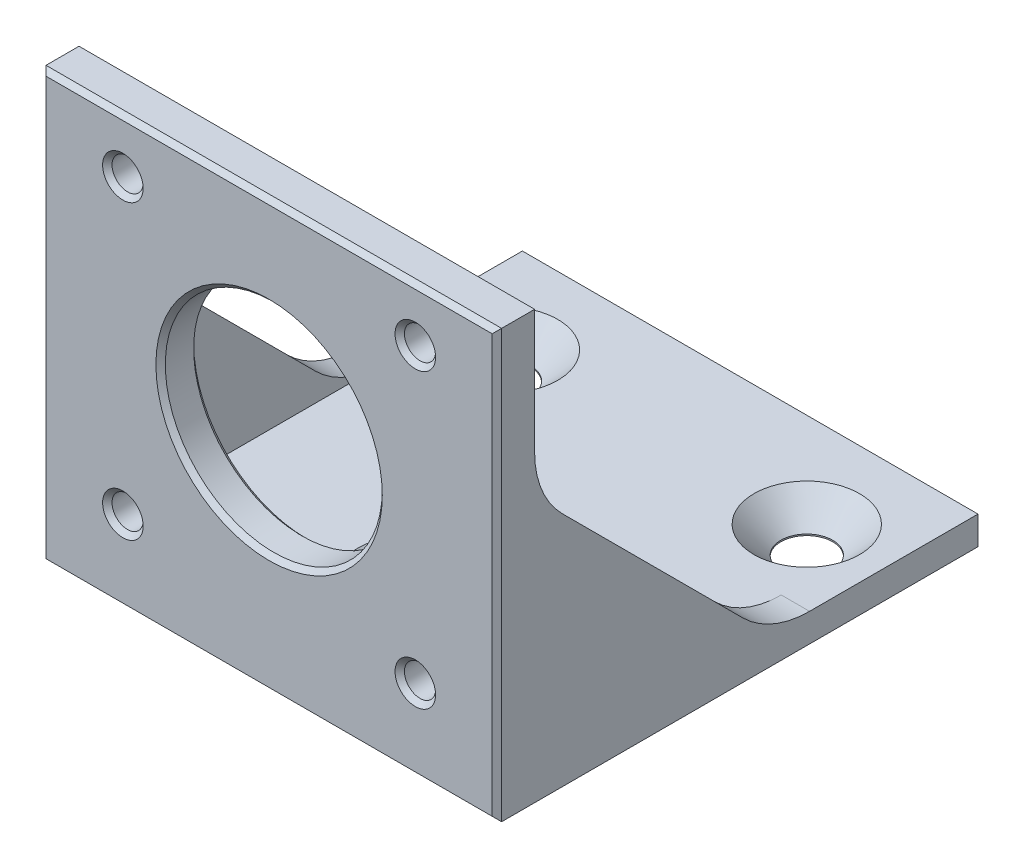
ISO-10303-21;
HEADER;
FILE_DESCRIPTION(('STEP AP214'),'2;1');
FILE_NAME('part.step','',(''),(''),'','','');
FILE_SCHEMA(('AUTOMOTIVE_DESIGN { 1 0 10303 214 1 1 1 1 }'));
ENDSEC;
DATA;
#1=APPLICATION_CONTEXT('core data for automotive mechanical design processes');
#2=APPLICATION_PROTOCOL_DEFINITION('international standard','automotive_design',2000,#1);
#3=PRODUCT_CONTEXT('',#1,'mechanical');
#4=PRODUCT('Part','Part','',(#3));
#5=PRODUCT_RELATED_PRODUCT_CATEGORY('part','',(#4));
#6=PRODUCT_DEFINITION_FORMATION('','',#4);
#7=PRODUCT_DEFINITION_CONTEXT('part definition',#1,'design');
#8=PRODUCT_DEFINITION('design','',#6,#7);
#9=PRODUCT_DEFINITION_SHAPE('','',#8);
#10=(LENGTH_UNIT() NAMED_UNIT(*) SI_UNIT(.MILLI.,.METRE.));
#11=(NAMED_UNIT(*) PLANE_ANGLE_UNIT() SI_UNIT($,.RADIAN.));
#12=(NAMED_UNIT(*) SI_UNIT($,.STERADIAN.) SOLID_ANGLE_UNIT());
#13=UNCERTAINTY_MEASURE_WITH_UNIT(LENGTH_MEASURE(1.E-05),#10,'distance_accuracy_value','');
#14=(GEOMETRIC_REPRESENTATION_CONTEXT(3) GLOBAL_UNCERTAINTY_ASSIGNED_CONTEXT((#13)) GLOBAL_UNIT_ASSIGNED_CONTEXT((#10,
#11,#12)) REPRESENTATION_CONTEXT('',''));
#15=CARTESIAN_POINT('',(0.,0.,0.));
#16=DIRECTION('',(0.,0.,1.));
#17=DIRECTION('',(1.,0.,0.));
#18=AXIS2_PLACEMENT_3D('',#15,#16,#17);
#19=CARTESIAN_POINT('',(0.,-24.15,0.));
#20=DIRECTION('',(0.,-1.,0.));
#21=DIRECTION('',(1.,0.,0.));
#22=AXIS2_PLACEMENT_3D('',#19,#20,#21);
#23=PLANE('',#22);
#24=CARTESIAN_POINT('',(0.,-24.15,-11.));
#25=DIRECTION('',(0.,1.,0.));
#26=DIRECTION('',(0.,0.,1.));
#27=AXIS2_PLACEMENT_3D('',#24,#25,#26);
#28=CIRCLE('',#27,2.75);
#29=CARTESIAN_POINT('',(0.,-24.15,-8.25));
#30=VERTEX_POINT('',#29);
#31=EDGE_CURVE('E505',#30,#30,#28,.T.);
#32=ORIENTED_EDGE('',*,*,#31,.T.);
#33=EDGE_LOOP('',(#32));
#34=FACE_BOUND('',#33,.T.);
#35=CARTESIAN_POINT('',(16.,-24.15,-37.));
#36=DIRECTION('',(0.,1.,0.));
#37=DIRECTION('',(0.,0.,1.));
#38=AXIS2_PLACEMENT_3D('',#35,#36,#37);
#39=CIRCLE('',#38,2.75);
#40=CARTESIAN_POINT('',(16.,-24.15,-34.25));
#41=VERTEX_POINT('',#40);
#42=EDGE_CURVE('E496',#41,#41,#39,.T.);
#43=ORIENTED_EDGE('',*,*,#42,.T.);
#44=EDGE_LOOP('',(#43));
#45=FACE_BOUND('',#44,.T.);
#46=DIRECTION('',(0.,0.,1.));
#47=VECTOR('',#46,1.);
#48=CARTESIAN_POINT('',(24.15,-24.15,4.));
#49=LINE('',#48,#47);
#50=CARTESIAN_POINT('',(24.15,-24.15,-47.));
#51=VERTEX_POINT('',#50);
#52=CARTESIAN_POINT('',(24.15,-24.15,3.49999999999999));
#53=VERTEX_POINT('',#52);
#54=EDGE_CURVE('E463',#51,#53,#49,.T.);
#55=ORIENTED_EDGE('',*,*,#54,.T.);
#56=DIRECTION('',(-1.,0.,0.));
#57=VECTOR('',#56,1.);
#58=CARTESIAN_POINT('',(0.,-24.15,3.49999999999999));
#59=LINE('',#58,#57);
#60=CARTESIAN_POINT('',(-24.15,-24.15,3.49999999999999));
#61=VERTEX_POINT('',#60);
#62=EDGE_CURVE('E54',#53,#61,#59,.T.);
#63=ORIENTED_EDGE('',*,*,#62,.T.);
#64=DIRECTION('',(0.,0.,-1.));
#65=VECTOR('',#64,1.);
#66=CARTESIAN_POINT('',(-24.15,-24.15,4.));
#67=LINE('',#66,#65);
#68=CARTESIAN_POINT('',(-24.15,-24.15,-47.));
#69=VERTEX_POINT('',#68);
#70=EDGE_CURVE('E467',#61,#69,#67,.T.);
#71=ORIENTED_EDGE('',*,*,#70,.T.);
#72=DIRECTION('',(1.,0.,0.));
#73=VECTOR('',#72,1.);
#74=CARTESIAN_POINT('',(-24.15,-24.15,-47.));
#75=LINE('',#74,#73);
#76=EDGE_CURVE('E473',#69,#51,#75,.T.);
#77=ORIENTED_EDGE('',*,*,#76,.T.);
#78=EDGE_LOOP('',(#55,#63,#71,#77));
#79=FACE_BOUND('',#78,.T.);
#80=CARTESIAN_POINT('',(-16.,-24.15,-37.));
#81=DIRECTION('',(0.,1.,0.));
#82=DIRECTION('',(0.,0.,1.));
#83=AXIS2_PLACEMENT_3D('',#80,#81,#82);
#84=CIRCLE('',#83,2.75);
#85=CARTESIAN_POINT('',(-16.,-24.15,-34.25));
#86=VERTEX_POINT('',#85);
#87=EDGE_CURVE('E282',#86,#86,#84,.T.);
#88=ORIENTED_EDGE('',*,*,#87,.T.);
#89=EDGE_LOOP('',(#88));
#90=FACE_BOUND('',#89,.T.);
#91=ADVANCED_FACE('F38',(#34,#45,#79,#90),#23,.T.);
#92=CARTESIAN_POINT('',(0.,0.,0.));
#93=DIRECTION('',(0.,0.,1.));
#94=DIRECTION('',(1.,0.,0.));
#95=AXIS2_PLACEMENT_3D('',#92,#93,#94);
#96=PLANE('',#95);
#97=CARTESIAN_POINT('',(0.,0.,0.));
#98=DIRECTION('',(0.,0.,1.));
#99=DIRECTION('',(1.,0.,0.));
#100=AXIS2_PLACEMENT_3D('',#97,#98,#99);
#101=CIRCLE('',#100,12.);
#102=CARTESIAN_POINT('',(12.,0.,0.));
#103=VERTEX_POINT('',#102);
#104=EDGE_CURVE('E47',#103,#103,#101,.T.);
#105=ORIENTED_EDGE('',*,*,#104,.T.);
#106=EDGE_LOOP('',(#105));
#107=FACE_BOUND('',#106,.T.);
#108=CARTESIAN_POINT('',(-15.5,-15.5,0.));
#109=DIRECTION('',(0.,0.,1.));
#110=DIRECTION('',(1.,0.,0.));
#111=AXIS2_PLACEMENT_3D('',#108,#109,#110);
#112=CIRCLE('',#111,1.65);
#113=CARTESIAN_POINT('',(-13.85,-15.5,0.));
#114=VERTEX_POINT('',#113);
#115=EDGE_CURVE('E454',#114,#114,#112,.T.);
#116=ORIENTED_EDGE('',*,*,#115,.T.);
#117=EDGE_LOOP('',(#116));
#118=FACE_BOUND('',#117,.T.);
#119=CARTESIAN_POINT('',(15.5,-15.5,0.));
#120=DIRECTION('',(0.,0.,1.));
#121=DIRECTION('',(1.,0.,0.));
#122=AXIS2_PLACEMENT_3D('',#119,#120,#121);
#123=CIRCLE('',#122,1.65);
#124=CARTESIAN_POINT('',(17.15,-15.5,0.));
#125=VERTEX_POINT('',#124);
#126=EDGE_CURVE('E449',#125,#125,#123,.T.);
#127=ORIENTED_EDGE('',*,*,#126,.T.);
#128=EDGE_LOOP('',(#127));
#129=FACE_BOUND('',#128,.T.);
#130=CARTESIAN_POINT('',(15.5,15.5,0.));
#131=DIRECTION('',(0.,0.,1.));
#132=DIRECTION('',(1.,0.,0.));
#133=AXIS2_PLACEMENT_3D('',#130,#131,#132);
#134=CIRCLE('',#133,1.65);
#135=CARTESIAN_POINT('',(17.15,15.5,0.));
#136=VERTEX_POINT('',#135);
#137=EDGE_CURVE('E447',#136,#136,#134,.T.);
#138=ORIENTED_EDGE('',*,*,#137,.T.);
#139=EDGE_LOOP('',(#138));
#140=FACE_BOUND('',#139,.T.);
#141=CARTESIAN_POINT('',(-15.5,15.5,0.));
#142=DIRECTION('',(0.,0.,1.));
#143=DIRECTION('',(1.,0.,0.));
#144=AXIS2_PLACEMENT_3D('',#141,#142,#143);
#145=CIRCLE('',#144,1.65);
#146=CARTESIAN_POINT('',(-13.85,15.5,0.));
#147=VERTEX_POINT('',#146);
#148=EDGE_CURVE('E189',#147,#147,#145,.T.);
#149=ORIENTED_EDGE('',*,*,#148,.T.);
#150=EDGE_LOOP('',(#149));
#151=FACE_BOUND('',#150,.T.);
#152=DIRECTION('',(0.,1.,0.));
#153=VECTOR('',#152,1.);
#154=CARTESIAN_POINT('',(-21.15,-21.15,0.));
#155=LINE('',#154,#153);
#156=CARTESIAN_POINT('',(-21.15,-21.15,0.));
#157=VERTEX_POINT('',#156);
#158=CARTESIAN_POINT('',(-21.15,7.99213562373095,0.));
#159=VERTEX_POINT('',#158);
#160=EDGE_CURVE('E479',#157,#159,#155,.T.);
#161=ORIENTED_EDGE('',*,*,#160,.T.);
#162=DIRECTION('',(-1.,0.,0.));
#163=VECTOR('',#162,1.);
#164=CARTESIAN_POINT('',(0.,7.99213562373095,0.));
#165=LINE('',#164,#163);
#166=CARTESIAN_POINT('',(-24.15,7.99213562373095,0.));
#167=VERTEX_POINT('',#166);
#168=EDGE_CURVE('E209',#159,#167,#165,.T.);
#169=ORIENTED_EDGE('',*,*,#168,.T.);
#170=DIRECTION('',(0.,-1.,0.));
#171=VECTOR('',#170,1.);
#172=CARTESIAN_POINT('',(-24.15,-21.15,0.));
#173=LINE('',#172,#171);
#174=CARTESIAN_POINT('',(-24.15,21.15,0.));
#175=VERTEX_POINT('',#174);
#176=EDGE_CURVE('E183',#175,#167,#173,.T.);
#177=ORIENTED_EDGE('',*,*,#176,.F.);
#178=DIRECTION('',(-1.,0.,0.));
#179=VECTOR('',#178,1.);
#180=CARTESIAN_POINT('',(24.15,21.15,0.));
#181=LINE('',#180,#179);
#182=CARTESIAN_POINT('',(24.15,21.15,0.));
#183=VERTEX_POINT('',#182);
#184=EDGE_CURVE('E186',#183,#175,#181,.T.);
#185=ORIENTED_EDGE('',*,*,#184,.F.);
#186=DIRECTION('',(0.,1.,0.));
#187=VECTOR('',#186,1.);
#188=CARTESIAN_POINT('',(24.15,-21.15,0.));
#189=LINE('',#188,#187);
#190=CARTESIAN_POINT('',(24.15,7.99213562373095,0.));
#191=VERTEX_POINT('',#190);
#192=EDGE_CURVE('E182',#191,#183,#189,.T.);
#193=ORIENTED_EDGE('',*,*,#192,.F.);
#194=DIRECTION('',(1.,0.,0.));
#195=VECTOR('',#194,1.);
#196=CARTESIAN_POINT('',(21.15,7.99213562373095,0.));
#197=LINE('',#196,#195);
#198=CARTESIAN_POINT('',(21.15,7.99213562373095,0.));
#199=VERTEX_POINT('',#198);
#200=EDGE_CURVE('E173',#191,#199,#197,.F.);
#201=ORIENTED_EDGE('',*,*,#200,.T.);
#202=DIRECTION('',(0.,1.,0.));
#203=VECTOR('',#202,1.);
#204=CARTESIAN_POINT('',(21.15,-21.15,0.));
#205=LINE('',#204,#203);
#206=CARTESIAN_POINT('',(21.15,-21.15,0.));
#207=VERTEX_POINT('',#206);
#208=EDGE_CURVE('E156',#207,#199,#205,.T.);
#209=ORIENTED_EDGE('',*,*,#208,.F.);
#210=DIRECTION('',(1.,0.,0.));
#211=VECTOR('',#210,1.);
#212=CARTESIAN_POINT('',(24.15,-21.15,0.));
#213=LINE('',#212,#211);
#214=EDGE_CURVE('E170',#157,#207,#213,.T.);
#215=ORIENTED_EDGE('',*,*,#214,.F.);
#216=EDGE_LOOP('',(#161,#169,#177,#185,#193,#201,#209,#215));
#217=FACE_BOUND('',#216,.T.);
#218=ADVANCED_FACE('F169',(#107,#118,#129,#140,#151,#217),#96,.F.);
#219=CARTESIAN_POINT('',(0.,-21.15,0.));
#220=DIRECTION('',(0.,-1.,0.));
#221=DIRECTION('',(1.,0.,0.));
#222=AXIS2_PLACEMENT_3D('',#219,#220,#221);
#223=PLANE('',#222);
#224=CARTESIAN_POINT('',(0.,-21.15,-11.));
#225=DIRECTION('',(0.,1.,0.));
#226=DIRECTION('',(0.,0.,1.));
#227=AXIS2_PLACEMENT_3D('',#224,#225,#226);
#228=CIRCLE('',#227,5.6);
#229=CARTESIAN_POINT('',(0.,-21.15,-5.4));
#230=VERTEX_POINT('',#229);
#231=EDGE_CURVE('E510',#230,#230,#228,.T.);
#232=ORIENTED_EDGE('',*,*,#231,.F.);
#233=EDGE_LOOP('',(#232));
#234=FACE_BOUND('',#233,.T.);
#235=CARTESIAN_POINT('',(16.,-21.15,-37.));
#236=DIRECTION('',(0.,1.,0.));
#237=DIRECTION('',(0.,0.,1.));
#238=AXIS2_PLACEMENT_3D('',#235,#236,#237);
#239=CIRCLE('',#238,5.6);
#240=CARTESIAN_POINT('',(16.,-21.15,-31.4));
#241=VERTEX_POINT('',#240);
#242=EDGE_CURVE('E502',#241,#241,#239,.T.);
#243=ORIENTED_EDGE('',*,*,#242,.F.);
#244=EDGE_LOOP('',(#243));
#245=FACE_BOUND('',#244,.T.);
#246=CARTESIAN_POINT('',(-16.,-21.15,-37.));
#247=DIRECTION('',(0.,1.,0.));
#248=DIRECTION('',(0.,0.,1.));
#249=AXIS2_PLACEMENT_3D('',#246,#247,#248);
#250=CIRCLE('',#249,5.6);
#251=CARTESIAN_POINT('',(-16.,-21.15,-31.4));
#252=VERTEX_POINT('',#251);
#253=EDGE_CURVE('E493',#252,#252,#250,.T.);
#254=ORIENTED_EDGE('',*,*,#253,.F.);
#255=EDGE_LOOP('',(#254));
#256=FACE_BOUND('',#255,.T.);
#257=DIRECTION('',(0.,0.,-1.));
#258=VECTOR('',#257,1.);
#259=CARTESIAN_POINT('',(-24.15,-21.15,4.));
#260=LINE('',#259,#258);
#261=CARTESIAN_POINT('',(-24.15,-21.15,-29.1421356237309));
#262=VERTEX_POINT('',#261);
#263=CARTESIAN_POINT('',(-24.15,-21.15,-47.));
#264=VERTEX_POINT('',#263);
#265=EDGE_CURVE('E470',#262,#264,#260,.T.);
#266=ORIENTED_EDGE('',*,*,#265,.F.);
#267=DIRECTION('',(-1.,0.,0.));
#268=VECTOR('',#267,1.);
#269=CARTESIAN_POINT('',(0.,-21.15,-29.1421356237309));
#270=LINE('',#269,#268);
#271=CARTESIAN_POINT('',(-21.15,-21.15,-29.1421356237309));
#272=VERTEX_POINT('',#271);
#273=EDGE_CURVE('E206',#262,#272,#270,.F.);
#274=ORIENTED_EDGE('',*,*,#273,.T.);
#275=DIRECTION('',(0.,0.,1.));
#276=VECTOR('',#275,1.);
#277=CARTESIAN_POINT('',(-21.15,-21.15,-25.));
#278=LINE('',#277,#276);
#279=EDGE_CURVE('E181',#272,#157,#278,.T.);
#280=ORIENTED_EDGE('',*,*,#279,.T.);
#281=ORIENTED_EDGE('',*,*,#214,.T.);
#282=DIRECTION('',(0.,0.,1.));
#283=VECTOR('',#282,1.);
#284=CARTESIAN_POINT('',(21.15,-21.15,-25.));
#285=LINE('',#284,#283);
#286=CARTESIAN_POINT('',(21.15,-21.15,-29.1421356237309));
#287=VERTEX_POINT('',#286);
#288=EDGE_CURVE('E153',#287,#207,#285,.T.);
#289=ORIENTED_EDGE('',*,*,#288,.F.);
#290=DIRECTION('',(1.,0.,0.));
#291=VECTOR('',#290,1.);
#292=CARTESIAN_POINT('',(24.15,-21.15,-29.1421356237309));
#293=LINE('',#292,#291);
#294=CARTESIAN_POINT('',(24.15,-21.15,-29.1421356237309));
#295=VERTEX_POINT('',#294);
#296=EDGE_CURVE('E204',#287,#295,#293,.T.);
#297=ORIENTED_EDGE('',*,*,#296,.T.);
#298=DIRECTION('',(0.,0.,1.));
#299=VECTOR('',#298,1.);
#300=CARTESIAN_POINT('',(24.15,-21.15,4.));
#301=LINE('',#300,#299);
#302=CARTESIAN_POINT('',(24.15,-21.15,-47.));
#303=VERTEX_POINT('',#302);
#304=EDGE_CURVE('E464',#303,#295,#301,.T.);
#305=ORIENTED_EDGE('',*,*,#304,.F.);
#306=DIRECTION('',(1.,0.,0.));
#307=VECTOR('',#306,1.);
#308=CARTESIAN_POINT('',(-24.15,-21.15,-47.));
#309=LINE('',#308,#307);
#310=EDGE_CURVE('E468',#264,#303,#309,.T.);
#311=ORIENTED_EDGE('',*,*,#310,.F.);
#312=EDGE_LOOP('',(#266,#274,#280,#281,#289,#297,#305,#311));
#313=FACE_BOUND('',#312,.T.);
#314=ADVANCED_FACE('F179',(#234,#245,#256,#313),#223,.F.);
#315=CARTESIAN_POINT('',(0.,0.,4.));
#316=DIRECTION('',(0.,0.,1.));
#317=DIRECTION('',(1.,0.,0.));
#318=AXIS2_PLACEMENT_3D('',#315,#316,#317);
#319=PLANE('',#318);
#320=CARTESIAN_POINT('',(-15.5,-15.5,4.));
#321=DIRECTION('',(0.,0.,1.));
#322=DIRECTION('',(1.,0.,0.));
#323=AXIS2_PLACEMENT_3D('',#320,#321,#322);
#324=CIRCLE('',#323,2.15);
#325=CARTESIAN_POINT('',(-13.35,-15.5,4.));
#326=VERTEX_POINT('',#325);
#327=EDGE_CURVE('E257',#326,#326,#324,.F.);
#328=ORIENTED_EDGE('',*,*,#327,.T.);
#329=EDGE_LOOP('',(#328));
#330=FACE_BOUND('',#329,.T.);
#331=CARTESIAN_POINT('',(15.5,15.5,4.));
#332=DIRECTION('',(0.,0.,1.));
#333=DIRECTION('',(1.,0.,0.));
#334=AXIS2_PLACEMENT_3D('',#331,#332,#333);
#335=CIRCLE('',#334,2.15);
#336=CARTESIAN_POINT('',(17.65,15.5,4.));
#337=VERTEX_POINT('',#336);
#338=EDGE_CURVE('E254',#337,#337,#335,.F.);
#339=ORIENTED_EDGE('',*,*,#338,.T.);
#340=EDGE_LOOP('',(#339));
#341=FACE_BOUND('',#340,.T.);
#342=CARTESIAN_POINT('',(0.,0.,4.));
#343=DIRECTION('',(0.,0.,1.));
#344=DIRECTION('',(1.,0.,0.));
#345=AXIS2_PLACEMENT_3D('',#342,#343,#344);
#346=CIRCLE('',#345,12.);
#347=CARTESIAN_POINT('',(12.,0.,4.));
#348=VERTEX_POINT('',#347);
#349=EDGE_CURVE('E251',#348,#348,#346,.F.);
#350=ORIENTED_EDGE('',*,*,#349,.T.);
#351=EDGE_LOOP('',(#350));
#352=FACE_BOUND('',#351,.T.);
#353=DIRECTION('',(0.,1.,0.));
#354=VECTOR('',#353,1.);
#355=CARTESIAN_POINT('',(23.65,21.15,4.));
#356=LINE('',#355,#354);
#357=CARTESIAN_POINT('',(23.65,-23.65,4.));
#358=VERTEX_POINT('',#357);
#359=CARTESIAN_POINT('',(23.65,20.65,4.));
#360=VERTEX_POINT('',#359);
#361=EDGE_CURVE('E246',#358,#360,#356,.T.);
#362=ORIENTED_EDGE('',*,*,#361,.T.);
#363=DIRECTION('',(-1.,0.,0.));
#364=VECTOR('',#363,1.);
#365=CARTESIAN_POINT('',(-24.15,20.65,4.));
#366=LINE('',#365,#364);
#367=CARTESIAN_POINT('',(-23.65,20.65,4.));
#368=VERTEX_POINT('',#367);
#369=EDGE_CURVE('E248',#360,#368,#366,.T.);
#370=ORIENTED_EDGE('',*,*,#369,.T.);
#371=DIRECTION('',(0.,-1.,0.));
#372=VECTOR('',#371,1.);
#373=CARTESIAN_POINT('',(-23.65,-24.15,4.));
#374=LINE('',#373,#372);
#375=CARTESIAN_POINT('',(-23.65,-23.65,4.));
#376=VERTEX_POINT('',#375);
#377=EDGE_CURVE('E242',#368,#376,#374,.T.);
#378=ORIENTED_EDGE('',*,*,#377,.T.);
#379=DIRECTION('',(1.,0.,0.));
#380=VECTOR('',#379,1.);
#381=CARTESIAN_POINT('',(0.,-23.65,4.));
#382=LINE('',#381,#380);
#383=EDGE_CURVE('E244',#376,#358,#382,.T.);
#384=ORIENTED_EDGE('',*,*,#383,.T.);
#385=EDGE_LOOP('',(#362,#370,#378,#384));
#386=FACE_BOUND('',#385,.T.);
#387=CARTESIAN_POINT('',(-15.5,15.5,4.));
#388=DIRECTION('',(0.,0.,1.));
#389=DIRECTION('',(1.,0.,0.));
#390=AXIS2_PLACEMENT_3D('',#387,#388,#389);
#391=CIRCLE('',#390,2.15);
#392=CARTESIAN_POINT('',(-13.35,15.5,4.));
#393=VERTEX_POINT('',#392);
#394=EDGE_CURVE('E239',#393,#393,#391,.F.);
#395=ORIENTED_EDGE('',*,*,#394,.T.);
#396=EDGE_LOOP('',(#395));
#397=FACE_BOUND('',#396,.T.);
#398=CARTESIAN_POINT('',(15.5,-15.5,4.));
#399=DIRECTION('',(0.,0.,1.));
#400=DIRECTION('',(1.,0.,0.));
#401=AXIS2_PLACEMENT_3D('',#398,#399,#400);
#402=CIRCLE('',#401,2.15000000000002);
#403=CARTESIAN_POINT('',(17.65,-15.5,4.));
#404=VERTEX_POINT('',#403);
#405=EDGE_CURVE('E236',#404,#404,#402,.F.);
#406=ORIENTED_EDGE('',*,*,#405,.T.);
#407=EDGE_LOOP('',(#406));
#408=FACE_BOUND('',#407,.T.);
#409=ADVANCED_FACE('F323',(#330,#341,#352,#386,#397,#408),#319,.T.);
#410=CARTESIAN_POINT('',(-24.15,-21.15,4.));
#411=DIRECTION('',(1.,0.,0.));
#412=DIRECTION('',(0.,1.,0.));
#413=AXIS2_PLACEMENT_3D('',#410,#411,#412);
#414=PLANE('',#413);
#415=ORIENTED_EDGE('',*,*,#70,.F.);
#416=DIRECTION('',(0.,1.,0.));
#417=VECTOR('',#416,1.);
#418=CARTESIAN_POINT('',(-24.15,21.15,3.49999999999999));
#419=LINE('',#418,#417);
#420=CARTESIAN_POINT('',(-24.15,21.15,3.49999999999999));
#421=VERTEX_POINT('',#420);
#422=EDGE_CURVE('E271',#61,#421,#419,.T.);
#423=ORIENTED_EDGE('',*,*,#422,.T.);
#424=DIRECTION('',(0.,0.,-1.));
#425=VECTOR('',#424,1.);
#426=CARTESIAN_POINT('',(-24.15,21.15,4.));
#427=LINE('',#426,#425);
#428=EDGE_CURVE('E195',#421,#175,#427,.T.);
#429=ORIENTED_EDGE('',*,*,#428,.T.);
#430=ORIENTED_EDGE('',*,*,#176,.T.);
#431=CARTESIAN_POINT('',(-24.15,7.99213562373095,-10.));
#432=DIRECTION('',(1.,0.,0.));
#433=DIRECTION('',(0.,1.,0.));
#434=AXIS2_PLACEMENT_3D('',#431,#432,#433);
#435=CIRCLE('',#434,10.);
#436=CARTESIAN_POINT('',(-24.15,0.921067811865474,-2.92893218813452));
#437=VERTEX_POINT('',#436);
#438=EDGE_CURVE('E221',#167,#437,#435,.T.);
#439=ORIENTED_EDGE('',*,*,#438,.T.);
#440=DIRECTION('',(0.,-0.707106781186547,-0.707106781186547));
#441=VECTOR('',#440,1.);
#442=CARTESIAN_POINT('',(-24.15,3.85,0.));
#443=LINE('',#442,#441);
#444=CARTESIAN_POINT('',(-24.15,-18.2210678118655,-22.0710678118655));
#445=VERTEX_POINT('',#444);
#446=EDGE_CURVE('E476',#437,#445,#443,.T.);
#447=ORIENTED_EDGE('',*,*,#446,.T.);
#448=CARTESIAN_POINT('',(-24.15,-11.15,-29.1421356237309));
#449=DIRECTION('',(1.,0.,0.));
#450=DIRECTION('',(0.,1.,0.));
#451=AXIS2_PLACEMENT_3D('',#448,#449,#450);
#452=CIRCLE('',#451,10.);
#453=EDGE_CURVE('E217',#445,#262,#452,.T.);
#454=ORIENTED_EDGE('',*,*,#453,.T.);
#455=ORIENTED_EDGE('',*,*,#265,.T.);
#456=DIRECTION('',(0.,1.,0.));
#457=VECTOR('',#456,1.);
#458=CARTESIAN_POINT('',(-24.15,-24.15,-47.));
#459=LINE('',#458,#457);
#460=EDGE_CURVE('E457',#69,#264,#459,.T.);
#461=ORIENTED_EDGE('',*,*,#460,.F.);
#462=EDGE_LOOP('',(#415,#423,#429,#430,#439,#447,#454,#455,#461));
#463=FACE_BOUND('',#462,.T.);
#464=ADVANCED_FACE('F351',(#463),#414,.F.);
#465=CARTESIAN_POINT('',(24.15,-21.15,4.));
#466=DIRECTION('',(-1.,0.,0.));
#467=DIRECTION('',(0.,0.,1.));
#468=AXIS2_PLACEMENT_3D('',#465,#466,#467);
#469=PLANE('',#468);
#470=DIRECTION('',(0.,0.,-1.));
#471=VECTOR('',#470,1.);
#472=CARTESIAN_POINT('',(24.15,21.15,4.));
#473=LINE('',#472,#471);
#474=CARTESIAN_POINT('',(24.15,21.15,3.49999999999999));
#475=VERTEX_POINT('',#474);
#476=EDGE_CURVE('E197',#475,#183,#473,.T.);
#477=ORIENTED_EDGE('',*,*,#476,.F.);
#478=DIRECTION('',(0.,-1.,0.));
#479=VECTOR('',#478,1.);
#480=CARTESIAN_POINT('',(24.15,-24.15,3.49999999999999));
#481=LINE('',#480,#479);
#482=EDGE_CURVE('E62',#475,#53,#481,.T.);
#483=ORIENTED_EDGE('',*,*,#482,.T.);
#484=ORIENTED_EDGE('',*,*,#54,.F.);
#485=DIRECTION('',(0.,1.,0.));
#486=VECTOR('',#485,1.);
#487=CARTESIAN_POINT('',(24.15,-24.15,-47.));
#488=LINE('',#487,#486);
#489=EDGE_CURVE('E460',#51,#303,#488,.T.);
#490=ORIENTED_EDGE('',*,*,#489,.T.);
#491=ORIENTED_EDGE('',*,*,#304,.T.);
#492=CARTESIAN_POINT('',(24.15,-11.15,-29.1421356237309));
#493=DIRECTION('',(-1.,0.,0.));
#494=DIRECTION('',(0.,0.,1.));
#495=AXIS2_PLACEMENT_3D('',#492,#493,#494);
#496=CIRCLE('',#495,10.);
#497=CARTESIAN_POINT('',(24.15,-18.2210678118655,-22.0710678118655));
#498=VERTEX_POINT('',#497);
#499=EDGE_CURVE('E230',#295,#498,#496,.T.);
#500=ORIENTED_EDGE('',*,*,#499,.T.);
#501=DIRECTION('',(0.,-0.707106781186547,-0.707106781186547));
#502=VECTOR('',#501,1.);
#503=CARTESIAN_POINT('',(24.15,3.85,0.));
#504=LINE('',#503,#502);
#505=CARTESIAN_POINT('',(24.15,0.921067811865474,-2.92893218813452));
#506=VERTEX_POINT('',#505);
#507=EDGE_CURVE('E175',#506,#498,#504,.T.);
#508=ORIENTED_EDGE('',*,*,#507,.F.);
#509=CARTESIAN_POINT('',(24.15,7.99213562373095,-10.));
#510=DIRECTION('',(-1.,0.,0.));
#511=DIRECTION('',(0.,0.,1.));
#512=AXIS2_PLACEMENT_3D('',#509,#510,#511);
#513=CIRCLE('',#512,10.);
#514=EDGE_CURVE('E226',#506,#191,#513,.T.);
#515=ORIENTED_EDGE('',*,*,#514,.T.);
#516=ORIENTED_EDGE('',*,*,#192,.T.);
#517=EDGE_LOOP('',(#477,#483,#484,#490,#491,#500,#508,#515,#516));
#518=FACE_BOUND('',#517,.T.);
#519=ADVANCED_FACE('F356',(#518),#469,.F.);
#520=CARTESIAN_POINT('',(24.15,21.15,4.));
#521=DIRECTION('',(0.,-1.,0.));
#522=DIRECTION('',(0.,0.,-1.));
#523=AXIS2_PLACEMENT_3D('',#520,#521,#522);
#524=PLANE('',#523);
#525=ORIENTED_EDGE('',*,*,#428,.F.);
#526=DIRECTION('',(1.,0.,0.));
#527=VECTOR('',#526,1.);
#528=CARTESIAN_POINT('',(24.15,21.15,3.49999999999999));
#529=LINE('',#528,#527);
#530=EDGE_CURVE('E266',#421,#475,#529,.T.);
#531=ORIENTED_EDGE('',*,*,#530,.T.);
#532=ORIENTED_EDGE('',*,*,#476,.T.);
#533=ORIENTED_EDGE('',*,*,#184,.T.);
#534=EDGE_LOOP('',(#525,#531,#532,#533));
#535=FACE_BOUND('',#534,.T.);
#536=ADVANCED_FACE('F348',(#535),#524,.F.);
#537=CARTESIAN_POINT('',(0.,0.,4.));
#538=DIRECTION('',(0.,0.,-1.));
#539=DIRECTION('',(-1.,0.,0.));
#540=AXIS2_PLACEMENT_3D('',#537,#538,#539);
#541=CYLINDRICAL_SURFACE('',#540,11.5);
#542=CARTESIAN_POINT('',(0.,0.,0.499999999999987));
#543=DIRECTION('',(0.,0.,1.));
#544=DIRECTION('',(1.,0.,0.));
#545=AXIS2_PLACEMENT_3D('',#542,#543,#544);
#546=CIRCLE('',#545,11.5);
#547=CARTESIAN_POINT('',(11.5,0.,0.499999999999987));
#548=VERTEX_POINT('',#547);
#549=EDGE_CURVE('E11',#548,#548,#546,.F.);
#550=ORIENTED_EDGE('',*,*,#549,.T.);
#551=EDGE_LOOP('',(#550));
#552=FACE_BOUND('',#551,.T.);
#553=CARTESIAN_POINT('',(0.,0.,3.49999999999998));
#554=DIRECTION('',(0.,0.,1.));
#555=DIRECTION('',(1.,0.,0.));
#556=AXIS2_PLACEMENT_3D('',#553,#554,#555);
#557=CIRCLE('',#556,11.5);
#558=CARTESIAN_POINT('',(11.5,0.,3.49999999999998));
#559=VERTEX_POINT('',#558);
#560=EDGE_CURVE('E263',#559,#559,#557,.T.);
#561=ORIENTED_EDGE('',*,*,#560,.T.);
#562=EDGE_LOOP('',(#561));
#563=FACE_BOUND('',#562,.T.);
#564=ADVANCED_FACE('F344',(#552,#563),#541,.F.);
#565=CARTESIAN_POINT('',(-15.5,15.5,4.));
#566=DIRECTION('',(0.,0.,-1.));
#567=DIRECTION('',(-1.,0.,0.));
#568=AXIS2_PLACEMENT_3D('',#565,#566,#567);
#569=CYLINDRICAL_SURFACE('',#568,1.65);
#570=CARTESIAN_POINT('',(-15.5,15.5,3.50000000000001));
#571=DIRECTION('',(0.,0.,1.));
#572=DIRECTION('',(1.,0.,0.));
#573=AXIS2_PLACEMENT_3D('',#570,#571,#572);
#574=CIRCLE('',#573,1.65);
#575=CARTESIAN_POINT('',(-13.85,15.5,3.50000000000001));
#576=VERTEX_POINT('',#575);
#577=EDGE_CURVE('E273',#576,#576,#574,.T.);
#578=ORIENTED_EDGE('',*,*,#577,.T.);
#579=EDGE_LOOP('',(#578));
#580=FACE_BOUND('',#579,.T.);
#581=ORIENTED_EDGE('',*,*,#148,.F.);
#582=EDGE_LOOP('',(#581));
#583=FACE_BOUND('',#582,.T.);
#584=ADVANCED_FACE('F340',(#580,#583),#569,.F.);
#585=CARTESIAN_POINT('',(15.5,15.5,4.));
#586=DIRECTION('',(0.,0.,-1.));
#587=DIRECTION('',(-1.,0.,0.));
#588=AXIS2_PLACEMENT_3D('',#585,#586,#587);
#589=CYLINDRICAL_SURFACE('',#588,1.65);
#590=CARTESIAN_POINT('',(15.5,15.5,3.5));
#591=DIRECTION('',(0.,0.,1.));
#592=DIRECTION('',(1.,0.,0.));
#593=AXIS2_PLACEMENT_3D('',#590,#591,#592);
#594=CIRCLE('',#593,1.65);
#595=CARTESIAN_POINT('',(17.15,15.5,3.5));
#596=VERTEX_POINT('',#595);
#597=EDGE_CURVE('E260',#596,#596,#594,.T.);
#598=ORIENTED_EDGE('',*,*,#597,.T.);
#599=EDGE_LOOP('',(#598));
#600=FACE_BOUND('',#599,.T.);
#601=ORIENTED_EDGE('',*,*,#137,.F.);
#602=EDGE_LOOP('',(#601));
#603=FACE_BOUND('',#602,.T.);
#604=ADVANCED_FACE('F336',(#600,#603),#589,.F.);
#605=CARTESIAN_POINT('',(15.5,-15.5,4.));
#606=DIRECTION('',(0.,0.,-1.));
#607=DIRECTION('',(-1.,0.,0.));
#608=AXIS2_PLACEMENT_3D('',#605,#606,#607);
#609=CYLINDRICAL_SURFACE('',#608,1.65);
#610=CARTESIAN_POINT('',(15.5,-15.5,3.49999999999999));
#611=DIRECTION('',(0.,0.,1.));
#612=DIRECTION('',(1.,0.,0.));
#613=AXIS2_PLACEMENT_3D('',#610,#611,#612);
#614=CIRCLE('',#613,1.65);
#615=CARTESIAN_POINT('',(17.15,-15.5,3.49999999999999));
#616=VERTEX_POINT('',#615);
#617=EDGE_CURVE('E276',#616,#616,#614,.T.);
#618=ORIENTED_EDGE('',*,*,#617,.T.);
#619=EDGE_LOOP('',(#618));
#620=FACE_BOUND('',#619,.T.);
#621=ORIENTED_EDGE('',*,*,#126,.F.);
#622=EDGE_LOOP('',(#621));
#623=FACE_BOUND('',#622,.T.);
#624=ADVANCED_FACE('F332',(#620,#623),#609,.F.);
#625=CARTESIAN_POINT('',(-15.5,-15.5,4.));
#626=DIRECTION('',(0.,0.,-1.));
#627=DIRECTION('',(-1.,0.,0.));
#628=AXIS2_PLACEMENT_3D('',#625,#626,#627);
#629=CYLINDRICAL_SURFACE('',#628,1.65);
#630=CARTESIAN_POINT('',(-15.5,-15.5,3.50000000000001));
#631=DIRECTION('',(0.,0.,1.));
#632=DIRECTION('',(1.,0.,0.));
#633=AXIS2_PLACEMENT_3D('',#630,#631,#632);
#634=CIRCLE('',#633,1.65);
#635=CARTESIAN_POINT('',(-13.85,-15.5,3.50000000000001));
#636=VERTEX_POINT('',#635);
#637=EDGE_CURVE('E233',#636,#636,#634,.T.);
#638=ORIENTED_EDGE('',*,*,#637,.T.);
#639=EDGE_LOOP('',(#638));
#640=FACE_BOUND('',#639,.T.);
#641=ORIENTED_EDGE('',*,*,#115,.F.);
#642=EDGE_LOOP('',(#641));
#643=FACE_BOUND('',#642,.T.);
#644=ADVANCED_FACE('F328',(#640,#643),#629,.F.);
#645=CARTESIAN_POINT('',(-24.15,-24.15,-47.));
#646=DIRECTION('',(0.,0.,1.));
#647=DIRECTION('',(1.,0.,0.));
#648=AXIS2_PLACEMENT_3D('',#645,#646,#647);
#649=PLANE('',#648);
#650=ORIENTED_EDGE('',*,*,#310,.T.);
#651=ORIENTED_EDGE('',*,*,#489,.F.);
#652=ORIENTED_EDGE('',*,*,#76,.F.);
#653=ORIENTED_EDGE('',*,*,#460,.T.);
#654=EDGE_LOOP('',(#650,#651,#652,#653));
#655=FACE_BOUND('',#654,.T.);
#656=ADVANCED_FACE('F325',(#655),#649,.F.);
#657=CARTESIAN_POINT('',(-21.15,3.85,0.));
#658=DIRECTION('',(0.,0.707106781186548,-0.707106781186548));
#659=DIRECTION('',(0.,0.707106781186548,0.707106781186548));
#660=AXIS2_PLACEMENT_3D('',#657,#658,#659);
#661=PLANE('',#660);
#662=DIRECTION('',(0.,-0.707106781186547,-0.707106781186547));
#663=VECTOR('',#662,1.);
#664=CARTESIAN_POINT('',(-21.15,3.85,0.));
#665=LINE('',#664,#663);
#666=CARTESIAN_POINT('',(-21.15,0.921067811865473,-2.92893218813452));
#667=VERTEX_POINT('',#666);
#668=CARTESIAN_POINT('',(-21.15,-18.2210678118655,-22.0710678118655));
#669=VERTEX_POINT('',#668);
#670=EDGE_CURVE('E481',#667,#669,#665,.T.);
#671=ORIENTED_EDGE('',*,*,#670,.T.);
#672=DIRECTION('',(-1.,0.,0.));
#673=VECTOR('',#672,1.);
#674=CARTESIAN_POINT('',(-21.15,-18.2210678118655,-22.0710678118655));
#675=LINE('',#674,#673);
#676=EDGE_CURVE('E201',#669,#445,#675,.T.);
#677=ORIENTED_EDGE('',*,*,#676,.T.);
#678=ORIENTED_EDGE('',*,*,#446,.F.);
#679=DIRECTION('',(-1.,0.,0.));
#680=VECTOR('',#679,1.);
#681=CARTESIAN_POINT('',(-21.15,0.921067811865473,-2.92893218813452));
#682=LINE('',#681,#680);
#683=EDGE_CURVE('E199',#437,#667,#682,.F.);
#684=ORIENTED_EDGE('',*,*,#683,.T.);
#685=EDGE_LOOP('',(#671,#677,#678,#684));
#686=FACE_BOUND('',#685,.T.);
#687=ADVANCED_FACE('F319',(#686),#661,.T.);
#688=CARTESIAN_POINT('',(-21.15,0.,0.));
#689=DIRECTION('',(1.,0.,0.));
#690=DIRECTION('',(0.,1.,0.));
#691=AXIS2_PLACEMENT_3D('',#688,#689,#690);
#692=PLANE('',#691);
#693=ORIENTED_EDGE('',*,*,#160,.F.);
#694=ORIENTED_EDGE('',*,*,#279,.F.);
#695=CARTESIAN_POINT('',(-21.15,-11.15,-29.1421356237309));
#696=DIRECTION('',(1.,0.,0.));
#697=DIRECTION('',(0.,1.,0.));
#698=AXIS2_PLACEMENT_3D('',#695,#696,#697);
#699=CIRCLE('',#698,10.);
#700=EDGE_CURVE('E219',#272,#669,#699,.F.);
#701=ORIENTED_EDGE('',*,*,#700,.T.);
#702=ORIENTED_EDGE('',*,*,#670,.F.);
#703=CARTESIAN_POINT('',(-21.15,7.99213562373095,-10.));
#704=DIRECTION('',(1.,0.,0.));
#705=DIRECTION('',(0.,1.,0.));
#706=AXIS2_PLACEMENT_3D('',#703,#704,#705);
#707=CIRCLE('',#706,10.);
#708=EDGE_CURVE('E223',#667,#159,#707,.F.);
#709=ORIENTED_EDGE('',*,*,#708,.T.);
#710=EDGE_LOOP('',(#693,#694,#701,#702,#709));
#711=FACE_BOUND('',#710,.T.);
#712=ADVANCED_FACE('F537',(#711),#692,.T.);
#713=CARTESIAN_POINT('',(21.15,3.85,0.));
#714=DIRECTION('',(0.,-0.707106781186548,0.707106781186548));
#715=DIRECTION('',(0.,-0.707106781186548,-0.707106781186548));
#716=AXIS2_PLACEMENT_3D('',#713,#714,#715);
#717=PLANE('',#716);
#718=DIRECTION('',(0.,-0.707106781186547,-0.707106781186547));
#719=VECTOR('',#718,1.);
#720=CARTESIAN_POINT('',(21.15,3.85,0.));
#721=LINE('',#720,#719);
#722=CARTESIAN_POINT('',(21.15,0.921067811865473,-2.92893218813452));
#723=VERTEX_POINT('',#722);
#724=CARTESIAN_POINT('',(21.15,-18.2210678118655,-22.0710678118655));
#725=VERTEX_POINT('',#724);
#726=EDGE_CURVE('E165',#723,#725,#721,.T.);
#727=ORIENTED_EDGE('',*,*,#726,.F.);
#728=DIRECTION('',(1.,0.,0.));
#729=VECTOR('',#728,1.);
#730=CARTESIAN_POINT('',(24.15,0.921067811865473,-2.92893218813452));
#731=LINE('',#730,#729);
#732=EDGE_CURVE('E214',#723,#506,#731,.T.);
#733=ORIENTED_EDGE('',*,*,#732,.T.);
#734=ORIENTED_EDGE('',*,*,#507,.T.);
#735=DIRECTION('',(1.,0.,0.));
#736=VECTOR('',#735,1.);
#737=CARTESIAN_POINT('',(21.15,-18.2210678118655,-22.0710678118655));
#738=LINE('',#737,#736);
#739=EDGE_CURVE('E212',#498,#725,#738,.F.);
#740=ORIENTED_EDGE('',*,*,#739,.T.);
#741=EDGE_LOOP('',(#727,#733,#734,#740));
#742=FACE_BOUND('',#741,.T.);
#743=ADVANCED_FACE('F535',(#742),#717,.F.);
#744=CARTESIAN_POINT('',(21.15,0.,0.));
#745=DIRECTION('',(-1.,0.,0.));
#746=DIRECTION('',(0.,1.,0.));
#747=AXIS2_PLACEMENT_3D('',#744,#745,#746);
#748=PLANE('',#747);
#749=ORIENTED_EDGE('',*,*,#208,.T.);
#750=CARTESIAN_POINT('',(21.15,7.99213562373095,-10.));
#751=DIRECTION('',(-1.,0.,0.));
#752=DIRECTION('',(0.,-1.,0.));
#753=AXIS2_PLACEMENT_3D('',#750,#751,#752);
#754=CIRCLE('',#753,10.);
#755=EDGE_CURVE('E228',#199,#723,#754,.F.);
#756=ORIENTED_EDGE('',*,*,#755,.T.);
#757=ORIENTED_EDGE('',*,*,#726,.T.);
#758=CARTESIAN_POINT('',(21.15,-11.15,-29.1421356237309));
#759=DIRECTION('',(-1.,0.,0.));
#760=DIRECTION('',(0.,-1.,0.));
#761=AXIS2_PLACEMENT_3D('',#758,#759,#760);
#762=CIRCLE('',#761,10.);
#763=EDGE_CURVE('E160',#725,#287,#762,.F.);
#764=ORIENTED_EDGE('',*,*,#763,.T.);
#765=ORIENTED_EDGE('',*,*,#288,.T.);
#766=EDGE_LOOP('',(#749,#756,#757,#764,#765));
#767=FACE_BOUND('',#766,.T.);
#768=ADVANCED_FACE('F155',(#767),#748,.T.);
#769=CARTESIAN_POINT('',(-21.15,-11.15,-29.1421356237309));
#770=DIRECTION('',(-1.,0.,0.));
#771=DIRECTION('',(0.,0.,1.));
#772=AXIS2_PLACEMENT_3D('',#769,#770,#771);
#773=CYLINDRICAL_SURFACE('',#772,10.);
#774=ORIENTED_EDGE('',*,*,#700,.F.);
#775=ORIENTED_EDGE('',*,*,#273,.F.);
#776=ORIENTED_EDGE('',*,*,#453,.F.);
#777=ORIENTED_EDGE('',*,*,#676,.F.);
#778=EDGE_LOOP('',(#774,#775,#776,#777));
#779=FACE_BOUND('',#778,.T.);
#780=ADVANCED_FACE('F363',(#779),#773,.F.);
#781=CARTESIAN_POINT('',(0.,7.99213562373095,-10.));
#782=DIRECTION('',(-1.,0.,0.));
#783=DIRECTION('',(0.,-1.,0.));
#784=AXIS2_PLACEMENT_3D('',#781,#782,#783);
#785=CYLINDRICAL_SURFACE('',#784,10.);
#786=ORIENTED_EDGE('',*,*,#708,.F.);
#787=ORIENTED_EDGE('',*,*,#683,.F.);
#788=ORIENTED_EDGE('',*,*,#438,.F.);
#789=ORIENTED_EDGE('',*,*,#168,.F.);
#790=EDGE_LOOP('',(#786,#787,#788,#789));
#791=FACE_BOUND('',#790,.T.);
#792=ADVANCED_FACE('F366',(#791),#785,.F.);
#793=CARTESIAN_POINT('',(21.15,7.99213562373095,-10.));
#794=DIRECTION('',(-1.,0.,0.));
#795=DIRECTION('',(0.,-1.,0.));
#796=AXIS2_PLACEMENT_3D('',#793,#794,#795);
#797=CYLINDRICAL_SURFACE('',#796,10.);
#798=ORIENTED_EDGE('',*,*,#755,.F.);
#799=ORIENTED_EDGE('',*,*,#200,.F.);
#800=ORIENTED_EDGE('',*,*,#514,.F.);
#801=ORIENTED_EDGE('',*,*,#732,.F.);
#802=EDGE_LOOP('',(#798,#799,#800,#801));
#803=FACE_BOUND('',#802,.T.);
#804=ADVANCED_FACE('F370',(#803),#797,.F.);
#805=CARTESIAN_POINT('',(0.,-11.15,-29.1421356237309));
#806=DIRECTION('',(-1.,0.,0.));
#807=DIRECTION('',(0.,-1.,0.));
#808=AXIS2_PLACEMENT_3D('',#805,#806,#807);
#809=CYLINDRICAL_SURFACE('',#808,10.);
#810=ORIENTED_EDGE('',*,*,#763,.F.);
#811=ORIENTED_EDGE('',*,*,#739,.F.);
#812=ORIENTED_EDGE('',*,*,#499,.F.);
#813=ORIENTED_EDGE('',*,*,#296,.F.);
#814=EDGE_LOOP('',(#810,#811,#812,#813));
#815=FACE_BOUND('',#814,.T.);
#816=ADVANCED_FACE('F374',(#815),#809,.F.);
#817=CARTESIAN_POINT('',(-15.5,-15.5,3.50000000000001));
#818=DIRECTION('',(0.,0.,1.));
#819=DIRECTION('',(1.,0.,0.));
#820=AXIS2_PLACEMENT_3D('',#817,#818,#819);
#821=CONICAL_SURFACE('',#820,1.65,0.785398163397454);
#822=ORIENTED_EDGE('',*,*,#327,.F.);
#823=EDGE_LOOP('',(#822));
#824=FACE_BOUND('',#823,.T.);
#825=ORIENTED_EDGE('',*,*,#637,.F.);
#826=EDGE_LOOP('',(#825));
#827=FACE_BOUND('',#826,.T.);
#828=ADVANCED_FACE('F378',(#824,#827),#821,.F.);
#829=CARTESIAN_POINT('',(15.5,15.5,3.5));
#830=DIRECTION('',(0.,0.,1.));
#831=DIRECTION('',(1.,0.,0.));
#832=AXIS2_PLACEMENT_3D('',#829,#830,#831);
#833=CONICAL_SURFACE('',#832,1.65,0.78539816339745);
#834=ORIENTED_EDGE('',*,*,#338,.F.);
#835=EDGE_LOOP('',(#834));
#836=FACE_BOUND('',#835,.T.);
#837=ORIENTED_EDGE('',*,*,#597,.F.);
#838=EDGE_LOOP('',(#837));
#839=FACE_BOUND('',#838,.T.);
#840=ADVANCED_FACE('F386',(#836,#839),#833,.F.);
#841=CARTESIAN_POINT('',(0.,0.,3.49999999999998));
#842=DIRECTION('',(0.,0.,1.));
#843=DIRECTION('',(1.,0.,0.));
#844=AXIS2_PLACEMENT_3D('',#841,#842,#843);
#845=CONICAL_SURFACE('',#844,11.5,0.78539816339745);
#846=ORIENTED_EDGE('',*,*,#349,.F.);
#847=EDGE_LOOP('',(#846));
#848=FACE_BOUND('',#847,.T.);
#849=ORIENTED_EDGE('',*,*,#560,.F.);
#850=EDGE_LOOP('',(#849));
#851=FACE_BOUND('',#850,.T.);
#852=ADVANCED_FACE('F393',(#848,#851),#845,.F.);
#853=CARTESIAN_POINT('',(0.,-24.15,3.49999999999999));
#854=DIRECTION('',(0.,0.707106781186552,-0.707106781186543));
#855=DIRECTION('',(-1.,0.,0.));
#856=AXIS2_PLACEMENT_3D('',#853,#854,#855);
#857=PLANE('',#856);
#858=DIRECTION('',(-0.577350269189624,-0.577350269189623,-0.57735026918963));
#859=VECTOR('',#858,1.);
#860=CARTESIAN_POINT('',(-15.7666666666667,-15.7666666666667,11.8833333333333));
#861=LINE('',#860,#859);
#862=EDGE_CURVE('E284',#61,#376,#861,.F.);
#863=ORIENTED_EDGE('',*,*,#862,.F.);
#864=ORIENTED_EDGE('',*,*,#62,.F.);
#865=DIRECTION('',(0.577350269189623,-0.577350269189623,-0.577350269189631));
#866=VECTOR('',#865,1.);
#867=CARTESIAN_POINT('',(16.1000000000001,-16.1000000000001,11.55));
#868=LINE('',#867,#866);
#869=EDGE_CURVE('E287',#358,#53,#868,.T.);
#870=ORIENTED_EDGE('',*,*,#869,.F.);
#871=ORIENTED_EDGE('',*,*,#383,.F.);
#872=EDGE_LOOP('',(#863,#864,#870,#871));
#873=FACE_BOUND('',#872,.T.);
#874=ADVANCED_FACE('F400',(#873),#857,.F.);
#875=CARTESIAN_POINT('',(23.65,0.,4.));
#876=DIRECTION('',(0.707106781186552,0.,0.707106781186543));
#877=DIRECTION('',(0.,-1.,0.));
#878=AXIS2_PLACEMENT_3D('',#875,#876,#877);
#879=PLANE('',#878);
#880=ORIENTED_EDGE('',*,*,#869,.T.);
#881=ORIENTED_EDGE('',*,*,#482,.F.);
#882=DIRECTION('',(-0.577350269189623,-0.577350269189623,0.577350269189631));
#883=VECTOR('',#882,1.);
#884=CARTESIAN_POINT('',(16.7666666666667,13.7666666666667,10.8833333333334));
#885=LINE('',#884,#883);
#886=EDGE_CURVE('E281',#360,#475,#885,.F.);
#887=ORIENTED_EDGE('',*,*,#886,.F.);
#888=ORIENTED_EDGE('',*,*,#361,.F.);
#889=EDGE_LOOP('',(#880,#881,#887,#888));
#890=FACE_BOUND('',#889,.T.);
#891=ADVANCED_FACE('F417',(#890),#879,.T.);
#892=CARTESIAN_POINT('',(-23.65,0.,4.));
#893=DIRECTION('',(-0.707106781186551,0.,0.707106781186544));
#894=DIRECTION('',(0.,1.,0.));
#895=AXIS2_PLACEMENT_3D('',#892,#893,#894);
#896=PLANE('',#895);
#897=ORIENTED_EDGE('',*,*,#862,.T.);
#898=ORIENTED_EDGE('',*,*,#377,.F.);
#899=DIRECTION('',(-0.577350269189625,0.577350269189623,-0.577350269189631));
#900=VECTOR('',#899,1.);
#901=CARTESIAN_POINT('',(-16.7666666666667,13.7666666666667,10.8833333333334));
#902=LINE('',#901,#900);
#903=EDGE_CURVE('E279',#421,#368,#902,.F.);
#904=ORIENTED_EDGE('',*,*,#903,.F.);
#905=ORIENTED_EDGE('',*,*,#422,.F.);
#906=EDGE_LOOP('',(#897,#898,#904,#905));
#907=FACE_BOUND('',#906,.T.);
#908=ADVANCED_FACE('F410',(#907),#896,.T.);
#909=CARTESIAN_POINT('',(0.,20.65,4.));
#910=DIRECTION('',(0.,0.707106781186552,0.707106781186543));
#911=DIRECTION('',(1.,0.,0.));
#912=AXIS2_PLACEMENT_3D('',#909,#910,#911);
#913=PLANE('',#912);
#914=ORIENTED_EDGE('',*,*,#886,.T.);
#915=ORIENTED_EDGE('',*,*,#530,.F.);
#916=ORIENTED_EDGE('',*,*,#903,.T.);
#917=ORIENTED_EDGE('',*,*,#369,.F.);
#918=EDGE_LOOP('',(#914,#915,#916,#917));
#919=FACE_BOUND('',#918,.T.);
#920=ADVANCED_FACE('F403',(#919),#913,.T.);
#921=CARTESIAN_POINT('',(-15.5,15.5,3.50000000000001));
#922=DIRECTION('',(0.,0.,1.));
#923=DIRECTION('',(1.,0.,0.));
#924=AXIS2_PLACEMENT_3D('',#921,#922,#923);
#925=CONICAL_SURFACE('',#924,1.65,0.785398163397456);
#926=ORIENTED_EDGE('',*,*,#394,.F.);
#927=EDGE_LOOP('',(#926));
#928=FACE_BOUND('',#927,.T.);
#929=ORIENTED_EDGE('',*,*,#577,.F.);
#930=EDGE_LOOP('',(#929));
#931=FACE_BOUND('',#930,.T.);
#932=ADVANCED_FACE('F305',(#928,#931),#925,.F.);
#933=CARTESIAN_POINT('',(15.5,-15.5,3.49999999999999));
#934=DIRECTION('',(0.,0.,1.));
#935=DIRECTION('',(1.,0.,0.));
#936=AXIS2_PLACEMENT_3D('',#933,#934,#935);
#937=CONICAL_SURFACE('',#936,1.65,0.785398163397451);
#938=ORIENTED_EDGE('',*,*,#405,.F.);
#939=EDGE_LOOP('',(#938));
#940=FACE_BOUND('',#939,.T.);
#941=ORIENTED_EDGE('',*,*,#617,.F.);
#942=EDGE_LOOP('',(#941));
#943=FACE_BOUND('',#942,.T.);
#944=ADVANCED_FACE('F296',(#940,#943),#937,.F.);
#945=CARTESIAN_POINT('',(0.,0.,0.));
#946=DIRECTION('',(0.,0.,-1.));
#947=DIRECTION('',(-1.,0.,0.));
#948=AXIS2_PLACEMENT_3D('',#945,#946,#947);
#949=CONICAL_SURFACE('',#948,12.,0.785398163397445);
#950=ORIENTED_EDGE('',*,*,#549,.F.);
#951=EDGE_LOOP('',(#950));
#952=FACE_BOUND('',#951,.T.);
#953=ORIENTED_EDGE('',*,*,#104,.F.);
#954=EDGE_LOOP('',(#953));
#955=FACE_BOUND('',#954,.T.);
#956=ADVANCED_FACE('F41',(#952,#955),#949,.F.);
#957=CARTESIAN_POINT('',(-16.,-21.15,-37.));
#958=DIRECTION('',(0.,1.,0.));
#959=DIRECTION('',(0.,0.,1.));
#960=AXIS2_PLACEMENT_3D('',#957,#958,#959);
#961=CYLINDRICAL_SURFACE('',#960,2.75);
#962=ORIENTED_EDGE('',*,*,#87,.F.);
#963=EDGE_LOOP('',(#962));
#964=FACE_BOUND('',#963,.T.);
#965=CARTESIAN_POINT('',(-16.,-24.,-37.));
#966=DIRECTION('',(0.,1.,0.));
#967=DIRECTION('',(0.,0.,1.));
#968=AXIS2_PLACEMENT_3D('',#965,#966,#967);
#969=CIRCLE('',#968,2.75);
#970=CARTESIAN_POINT('',(-16.,-24.,-34.25));
#971=VERTEX_POINT('',#970);
#972=EDGE_CURVE('E490',#971,#971,#969,.T.);
#973=ORIENTED_EDGE('',*,*,#972,.T.);
#974=EDGE_LOOP('',(#973));
#975=FACE_BOUND('',#974,.T.);
#976=ADVANCED_FACE('F295',(#964,#975),#961,.F.);
#977=CARTESIAN_POINT('',(-16.,-21.15,-37.));
#978=DIRECTION('',(0.,1.,0.));
#979=DIRECTION('',(0.,0.,1.));
#980=AXIS2_PLACEMENT_3D('',#977,#978,#979);
#981=CONICAL_SURFACE('',#980,5.6,0.785398163397448);
#982=ORIENTED_EDGE('',*,*,#972,.F.);
#983=EDGE_LOOP('',(#982));
#984=FACE_BOUND('',#983,.T.);
#985=ORIENTED_EDGE('',*,*,#253,.T.);
#986=EDGE_LOOP('',(#985));
#987=FACE_BOUND('',#986,.T.);
#988=ADVANCED_FACE('F302',(#984,#987),#981,.F.);
#989=CARTESIAN_POINT('',(16.,-21.15,-37.));
#990=DIRECTION('',(0.,1.,0.));
#991=DIRECTION('',(0.,0.,1.));
#992=AXIS2_PLACEMENT_3D('',#989,#990,#991);
#993=CYLINDRICAL_SURFACE('',#992,2.75);
#994=ORIENTED_EDGE('',*,*,#42,.F.);
#995=EDGE_LOOP('',(#994));
#996=FACE_BOUND('',#995,.T.);
#997=CARTESIAN_POINT('',(16.,-24.,-37.));
#998=DIRECTION('',(0.,1.,0.));
#999=DIRECTION('',(0.,0.,1.));
#1000=AXIS2_PLACEMENT_3D('',#997,#998,#999);
#1001=CIRCLE('',#1000,2.75);
#1002=CARTESIAN_POINT('',(16.,-24.,-34.25));
#1003=VERTEX_POINT('',#1002);
#1004=EDGE_CURVE('E499',#1003,#1003,#1001,.T.);
#1005=ORIENTED_EDGE('',*,*,#1004,.T.);
#1006=EDGE_LOOP('',(#1005));
#1007=FACE_BOUND('',#1006,.T.);
#1008=ADVANCED_FACE('F521',(#996,#1007),#993,.F.);
#1009=CARTESIAN_POINT('',(16.,-21.15,-37.));
#1010=DIRECTION('',(0.,1.,0.));
#1011=DIRECTION('',(0.,0.,1.));
#1012=AXIS2_PLACEMENT_3D('',#1009,#1010,#1011);
#1013=CONICAL_SURFACE('',#1012,5.6,0.785398163397448);
#1014=ORIENTED_EDGE('',*,*,#1004,.F.);
#1015=EDGE_LOOP('',(#1014));
#1016=FACE_BOUND('',#1015,.T.);
#1017=ORIENTED_EDGE('',*,*,#242,.T.);
#1018=EDGE_LOOP('',(#1017));
#1019=FACE_BOUND('',#1018,.T.);
#1020=ADVANCED_FACE('F527',(#1016,#1019),#1013,.F.);
#1021=CARTESIAN_POINT('',(0.,-21.15,-11.));
#1022=DIRECTION('',(0.,1.,0.));
#1023=DIRECTION('',(0.,0.,1.));
#1024=AXIS2_PLACEMENT_3D('',#1021,#1022,#1023);
#1025=CYLINDRICAL_SURFACE('',#1024,2.75);
#1026=ORIENTED_EDGE('',*,*,#31,.F.);
#1027=EDGE_LOOP('',(#1026));
#1028=FACE_BOUND('',#1027,.T.);
#1029=CARTESIAN_POINT('',(0.,-24.,-11.));
#1030=DIRECTION('',(0.,1.,0.));
#1031=DIRECTION('',(0.,0.,1.));
#1032=AXIS2_PLACEMENT_3D('',#1029,#1030,#1031);
#1033=CIRCLE('',#1032,2.75);
#1034=CARTESIAN_POINT('',(0.,-24.,-8.25));
#1035=VERTEX_POINT('',#1034);
#1036=EDGE_CURVE('E507',#1035,#1035,#1033,.T.);
#1037=ORIENTED_EDGE('',*,*,#1036,.T.);
#1038=EDGE_LOOP('',(#1037));
#1039=FACE_BOUND('',#1038,.T.);
#1040=ADVANCED_FACE('F866',(#1028,#1039),#1025,.F.);
#1041=CARTESIAN_POINT('',(0.,-21.15,-11.));
#1042=DIRECTION('',(0.,1.,0.));
#1043=DIRECTION('',(0.,0.,1.));
#1044=AXIS2_PLACEMENT_3D('',#1041,#1042,#1043);
#1045=CONICAL_SURFACE('',#1044,5.6,0.785398163397449);
#1046=ORIENTED_EDGE('',*,*,#1036,.F.);
#1047=EDGE_LOOP('',(#1046));
#1048=FACE_BOUND('',#1047,.T.);
#1049=ORIENTED_EDGE('',*,*,#231,.T.);
#1050=EDGE_LOOP('',(#1049));
#1051=FACE_BOUND('',#1050,.T.);
#1052=ADVANCED_FACE('F514',(#1048,#1051),#1045,.F.);
#1053=CLOSED_SHELL('',(#91,#218,#314,#409,#464,#519,#536,#564,#584,#604,#624,#644,#656,#687,
#712,#743,#768,#780,#792,#804,#816,#828,#840,#852,#874,#891,#908,#920,#932,#944,#956,#976,#988,
#1008,#1020,#1040,#1052));
#1054=MANIFOLD_SOLID_BREP('B2',#1053);
#1055=ADVANCED_BREP_SHAPE_REPRESENTATION('',(#18,#1054),#14);
#1056=SHAPE_DEFINITION_REPRESENTATION(#9,#1055);
ENDSEC;
END-ISO-10303-21;
